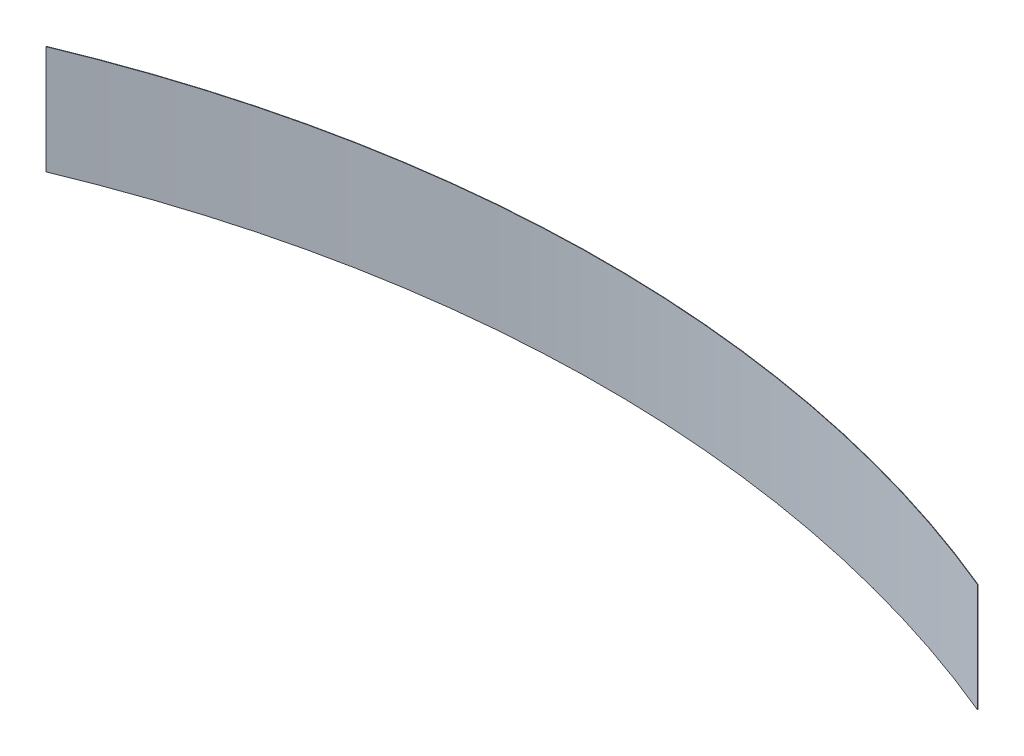
ISO-10303-21;
HEADER;
FILE_DESCRIPTION(('STEP AP214'),'2;1');
FILE_NAME('part.step','',(''),(''),'','','');
FILE_SCHEMA(('AUTOMOTIVE_DESIGN { 1 0 10303 214 1 1 1 1 }'));
ENDSEC;
DATA;
#1=APPLICATION_CONTEXT('core data for automotive mechanical design processes');
#2=APPLICATION_PROTOCOL_DEFINITION('international standard','automotive_design',2000,#1);
#3=PRODUCT_CONTEXT('',#1,'mechanical');
#4=PRODUCT('Part','Part','',(#3));
#5=PRODUCT_RELATED_PRODUCT_CATEGORY('part','',(#4));
#6=PRODUCT_DEFINITION_FORMATION('','',#4);
#7=PRODUCT_DEFINITION_CONTEXT('part definition',#1,'design');
#8=PRODUCT_DEFINITION('design','',#6,#7);
#9=PRODUCT_DEFINITION_SHAPE('','',#8);
#10=(LENGTH_UNIT() NAMED_UNIT(*) SI_UNIT(.MILLI.,.METRE.));
#11=(NAMED_UNIT(*) PLANE_ANGLE_UNIT() SI_UNIT($,.RADIAN.));
#12=(NAMED_UNIT(*) SI_UNIT($,.STERADIAN.) SOLID_ANGLE_UNIT());
#13=UNCERTAINTY_MEASURE_WITH_UNIT(LENGTH_MEASURE(1.E-05),#10,'distance_accuracy_value','');
#14=(GEOMETRIC_REPRESENTATION_CONTEXT(3) GLOBAL_UNCERTAINTY_ASSIGNED_CONTEXT((#13)) GLOBAL_UNIT_ASSIGNED_CONTEXT((#10,
#11,#12)) REPRESENTATION_CONTEXT('',''));
#15=CARTESIAN_POINT('',(0.,0.,0.));
#16=DIRECTION('',(0.,0.,1.));
#17=DIRECTION('',(1.,0.,0.));
#18=AXIS2_PLACEMENT_3D('',#15,#16,#17);
#19=CARTESIAN_POINT('',(-259.029968983084,30.1625,-622.982100725914));
#20=DIRECTION('',(0.923363928820252,0.,-0.383925845644218));
#21=DIRECTION('',(0.,-1.,0.));
#22=AXIS2_PLACEMENT_3D('',#19,#20,#21);
#23=PLANE('',#22);
#24=DIRECTION('',(0.383925845644218,0.,0.923363928820252));
#25=VECTOR('',#24,1.);
#26=CARTESIAN_POINT('',(-259.029968983083,60.325,-622.982100725914));
#27=LINE('',#26,#25);
#28=CARTESIAN_POINT('',(-259.127486147877,60.3250000000036,-623.216635163835));
#29=VERTEX_POINT('',#28);
#30=CARTESIAN_POINT('',(-259.029968983083,60.325,-622.982100725914));
#31=VERTEX_POINT('',#30);
#32=EDGE_CURVE('E12',#29,#31,#27,.T.);
#33=ORIENTED_EDGE('',*,*,#32,.F.);
#34=DIRECTION('',(0.,1.,0.));
#35=VECTOR('',#34,1.);
#36=CARTESIAN_POINT('',(-259.127486147881,-505.240473473654,-623.216635163833));
#37=LINE('',#36,#35);
#38=CARTESIAN_POINT('',(-259.127486147877,1.11022302462516E-13,-623.216635163834));
#39=VERTEX_POINT('',#38);
#40=EDGE_CURVE('E77',#29,#39,#37,.F.);
#41=ORIENTED_EDGE('',*,*,#40,.T.);
#42=DIRECTION('',(0.383925845644218,0.,0.923363928820252));
#43=VECTOR('',#42,1.);
#44=CARTESIAN_POINT('',(-259.029968983084,0.,-622.982100725914));
#45=LINE('',#44,#43);
#46=CARTESIAN_POINT('',(-259.029968983084,0.,-622.982100725914));
#47=VERTEX_POINT('',#46);
#48=EDGE_CURVE('E51',#39,#47,#45,.T.);
#49=ORIENTED_EDGE('',*,*,#48,.T.);
#50=DIRECTION('',(0.,-1.,0.));
#51=VECTOR('',#50,1.);
#52=CARTESIAN_POINT('',(-259.029968983083,60.325,-622.982100725914));
#53=LINE('',#52,#51);
#54=EDGE_CURVE('E80',#31,#47,#53,.T.);
#55=ORIENTED_EDGE('',*,*,#54,.F.);
#56=EDGE_LOOP('',(#33,#41,#49,#55));
#57=FACE_BOUND('',#56,.T.);
#58=ADVANCED_FACE('F41',(#57),#23,.F.);
#59=CARTESIAN_POINT('',(0.,0.,0.));
#60=DIRECTION('',(0.,1.,0.));
#61=DIRECTION('',(-1.,0.,0.));
#62=AXIS2_PLACEMENT_3D('',#59,#60,#61);
#63=PLANE('',#62);
#64=ORIENTED_EDGE('',*,*,#48,.F.);
#65=CARTESIAN_POINT('',(0.,5.55111512312578E-13,0.));
#66=DIRECTION('',(0.,1.,0.));
#67=DIRECTION('',(-1.,0.,0.));
#68=AXIS2_PLACEMENT_3D('',#65,#66,#67);
#69=CIRCLE('',#68,674.9415);
#70=CARTESIAN_POINT('',(259.127486147878,-3.66373598126302E-12,-623.216635163834));
#71=VERTEX_POINT('',#70);
#72=EDGE_CURVE('E92',#39,#71,#69,.F.);
#73=ORIENTED_EDGE('',*,*,#72,.T.);
#74=DIRECTION('',(-0.383925845644219,0.,0.923363928820252));
#75=VECTOR('',#74,1.);
#76=CARTESIAN_POINT('',(259.029968983084,-1.85892801078231E-12,-622.982100725914));
#77=LINE('',#76,#75);
#78=CARTESIAN_POINT('',(259.029968983084,-1.85892801078231E-12,-622.982100725914));
#79=VERTEX_POINT('',#78);
#80=EDGE_CURVE('E101',#71,#79,#77,.T.);
#81=ORIENTED_EDGE('',*,*,#80,.T.);
#82=CARTESIAN_POINT('',(0.,0.,0.));
#83=DIRECTION('',(0.,-1.,0.));
#84=DIRECTION('',(1.,0.,0.));
#85=AXIS2_PLACEMENT_3D('',#82,#83,#84);
#86=CIRCLE('',#85,674.6875);
#87=EDGE_CURVE('E96',#47,#79,#86,.T.);
#88=ORIENTED_EDGE('',*,*,#87,.F.);
#89=EDGE_LOOP('',(#64,#73,#81,#88));
#90=FACE_BOUND('',#89,.T.);
#91=ADVANCED_FACE('F109',(#90),#63,.F.);
#92=CARTESIAN_POINT('',(259.029968983084,30.162499999999,-622.982100725914));
#93=DIRECTION('',(-0.923363928820252,0.,-0.383925845644219));
#94=DIRECTION('',(0.,1.,0.));
#95=AXIS2_PLACEMENT_3D('',#92,#93,#94);
#96=PLANE('',#95);
#97=ORIENTED_EDGE('',*,*,#80,.F.);
#98=DIRECTION('',(0.,1.,0.));
#99=VECTOR('',#98,1.);
#100=CARTESIAN_POINT('',(259.127486147874,-505.240473473658,-623.216635163832));
#101=LINE('',#100,#99);
#102=CARTESIAN_POINT('',(259.127486147878,60.3249999999999,-623.216635163834));
#103=VERTEX_POINT('',#102);
#104=EDGE_CURVE('E94',#71,#103,#101,.T.);
#105=ORIENTED_EDGE('',*,*,#104,.T.);
#106=DIRECTION('',(-0.383925845644219,0.,0.923363928820252));
#107=VECTOR('',#106,1.);
#108=CARTESIAN_POINT('',(259.029968983084,60.3249999999999,-622.982100725914));
#109=LINE('',#108,#107);
#110=CARTESIAN_POINT('',(259.029968983084,60.3249999999999,-622.982100725914));
#111=VERTEX_POINT('',#110);
#112=EDGE_CURVE('E45',#103,#111,#109,.T.);
#113=ORIENTED_EDGE('',*,*,#112,.T.);
#114=DIRECTION('',(0.,1.,0.));
#115=VECTOR('',#114,1.);
#116=CARTESIAN_POINT('',(259.029968983084,0.,-622.982100725914));
#117=LINE('',#116,#115);
#118=EDGE_CURVE('E110',#79,#111,#117,.T.);
#119=ORIENTED_EDGE('',*,*,#118,.F.);
#120=EDGE_LOOP('',(#97,#105,#113,#119));
#121=FACE_BOUND('',#120,.T.);
#122=ADVANCED_FACE('F114',(#121),#96,.F.);
#123=CARTESIAN_POINT('',(4.44089209850063E-13,60.3250000000037,-2.22044604925031E-13));
#124=DIRECTION('',(0.,-1.,0.));
#125=DIRECTION('',(0.,0.,-1.));
#126=AXIS2_PLACEMENT_3D('',#123,#124,#125);
#127=PLANE('',#126);
#128=CARTESIAN_POINT('',(4.44226124586425E-13,60.3250000000041,-1.94357486677584E-13));
#129=DIRECTION('',(0.,1.,0.));
#130=DIRECTION('',(-1.,0.,0.));
#131=AXIS2_PLACEMENT_3D('',#128,#129,#130);
#132=CIRCLE('',#131,674.9415);
#133=EDGE_CURVE('E90',#103,#29,#132,.T.);
#134=ORIENTED_EDGE('',*,*,#133,.T.);
#135=ORIENTED_EDGE('',*,*,#32,.T.);
#136=CARTESIAN_POINT('',(4.44089209850063E-13,60.3250000000037,-2.22044604925031E-13));
#137=DIRECTION('',(0.,1.,0.));
#138=DIRECTION('',(0.,0.,1.));
#139=AXIS2_PLACEMENT_3D('',#136,#137,#138);
#140=CIRCLE('',#139,674.6875);
#141=EDGE_CURVE('E108',#111,#31,#140,.T.);
#142=ORIENTED_EDGE('',*,*,#141,.F.);
#143=ORIENTED_EDGE('',*,*,#112,.F.);
#144=EDGE_LOOP('',(#134,#135,#142,#143));
#145=FACE_BOUND('',#144,.T.);
#146=ADVANCED_FACE('F43',(#145),#127,.F.);
#147=CARTESIAN_POINT('',(-3.71924713249427E-12,-505.240473473653,1.88737914186277E-12));
#148=DIRECTION('',(0.,1.,0.));
#149=DIRECTION('',(-1.,0.,0.));
#150=AXIS2_PLACEMENT_3D('',#147,#148,#149);
#151=CYLINDRICAL_SURFACE('',#150,674.6875);
#152=ORIENTED_EDGE('',*,*,#118,.T.);
#153=ORIENTED_EDGE('',*,*,#141,.T.);
#154=ORIENTED_EDGE('',*,*,#54,.T.);
#155=ORIENTED_EDGE('',*,*,#87,.T.);
#156=EDGE_LOOP('',(#152,#153,#154,#155));
#157=FACE_BOUND('',#156,.T.);
#158=ADVANCED_FACE('F107',(#157),#151,.F.);
#159=CARTESIAN_POINT('',(-3.71924713249427E-12,-505.240473473653,1.88737914186277E-12));
#160=DIRECTION('',(0.,1.,0.));
#161=DIRECTION('',(-1.,0.,0.));
#162=AXIS2_PLACEMENT_3D('',#159,#160,#161);
#163=CYLINDRICAL_SURFACE('',#162,674.9415);
#164=ORIENTED_EDGE('',*,*,#104,.F.);
#165=ORIENTED_EDGE('',*,*,#72,.F.);
#166=ORIENTED_EDGE('',*,*,#40,.F.);
#167=ORIENTED_EDGE('',*,*,#133,.F.);
#168=EDGE_LOOP('',(#164,#165,#166,#167));
#169=FACE_BOUND('',#168,.T.);
#170=ADVANCED_FACE('F89',(#169),#163,.T.);
#171=CLOSED_SHELL('',(#58,#91,#122,#146,#158,#170));
#172=MANIFOLD_SOLID_BREP('B2',#171);
#173=ADVANCED_BREP_SHAPE_REPRESENTATION('',(#18,#172),#14);
#174=SHAPE_DEFINITION_REPRESENTATION(#9,#173);
ENDSEC;
END-ISO-10303-21;
